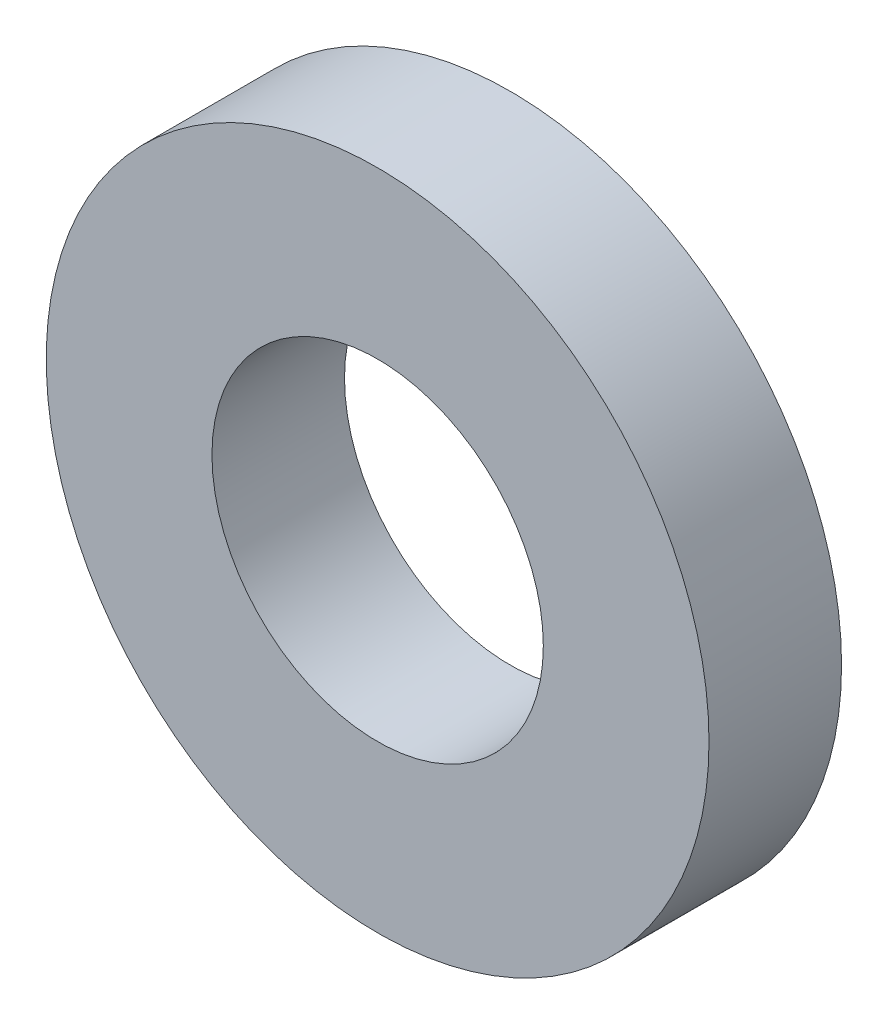
ISO-10303-21;
HEADER;
FILE_DESCRIPTION(('STEP AP214'),'2;1');
FILE_NAME('part.step','',(''),(''),'','','');
FILE_SCHEMA(('AUTOMOTIVE_DESIGN { 1 0 10303 214 1 1 1 1 }'));
ENDSEC;
DATA;
#1=APPLICATION_CONTEXT('core data for automotive mechanical design processes');
#2=APPLICATION_PROTOCOL_DEFINITION('international standard','automotive_design',2000,#1);
#3=PRODUCT_CONTEXT('',#1,'mechanical');
#4=PRODUCT('Part','Part','',(#3));
#5=PRODUCT_RELATED_PRODUCT_CATEGORY('part','',(#4));
#6=PRODUCT_DEFINITION_FORMATION('','',#4);
#7=PRODUCT_DEFINITION_CONTEXT('part definition',#1,'design');
#8=PRODUCT_DEFINITION('design','',#6,#7);
#9=PRODUCT_DEFINITION_SHAPE('','',#8);
#10=(LENGTH_UNIT() NAMED_UNIT(*) SI_UNIT(.MILLI.,.METRE.));
#11=(NAMED_UNIT(*) PLANE_ANGLE_UNIT() SI_UNIT($,.RADIAN.));
#12=(NAMED_UNIT(*) SI_UNIT($,.STERADIAN.) SOLID_ANGLE_UNIT());
#13=UNCERTAINTY_MEASURE_WITH_UNIT(LENGTH_MEASURE(1.E-05),#10,'distance_accuracy_value','');
#14=(GEOMETRIC_REPRESENTATION_CONTEXT(3) GLOBAL_UNCERTAINTY_ASSIGNED_CONTEXT((#13)) GLOBAL_UNIT_ASSIGNED_CONTEXT((#10,
#11,#12)) REPRESENTATION_CONTEXT('',''));
#15=CARTESIAN_POINT('',(0.,0.,0.));
#16=DIRECTION('',(0.,0.,1.));
#17=DIRECTION('',(1.,0.,0.));
#18=AXIS2_PLACEMENT_3D('',#15,#16,#17);
#19=CARTESIAN_POINT('',(0.,0.,4.));
#20=DIRECTION('',(0.,0.,1.));
#21=DIRECTION('',(1.,0.,0.));
#22=AXIS2_PLACEMENT_3D('',#19,#20,#21);
#23=PLANE('',#22);
#24=CARTESIAN_POINT('',(0.,0.,4.));
#25=DIRECTION('',(0.,0.,1.));
#26=DIRECTION('',(1.,0.,0.));
#27=AXIS2_PLACEMENT_3D('',#24,#25,#26);
#28=CIRCLE('',#27,10.);
#29=CARTESIAN_POINT('',(10.,0.,4.));
#30=VERTEX_POINT('',#29);
#31=EDGE_CURVE('E10',#30,#30,#28,.T.);
#32=ORIENTED_EDGE('',*,*,#31,.T.);
#33=EDGE_LOOP('',(#32));
#34=FACE_BOUND('',#33,.T.);
#35=CARTESIAN_POINT('',(0.,0.,4.));
#36=DIRECTION('',(0.,0.,1.));
#37=DIRECTION('',(1.,0.,0.));
#38=AXIS2_PLACEMENT_3D('',#35,#36,#37);
#39=CIRCLE('',#38,5.);
#40=CARTESIAN_POINT('',(5.,0.,4.));
#41=VERTEX_POINT('',#40);
#42=EDGE_CURVE('E50',#41,#41,#39,.T.);
#43=ORIENTED_EDGE('',*,*,#42,.F.);
#44=EDGE_LOOP('',(#43));
#45=FACE_BOUND('',#44,.T.);
#46=ADVANCED_FACE('F39',(#34,#45),#23,.T.);
#47=CARTESIAN_POINT('',(0.,0.,0.));
#48=DIRECTION('',(0.,0.,1.));
#49=DIRECTION('',(1.,0.,0.));
#50=AXIS2_PLACEMENT_3D('',#47,#48,#49);
#51=PLANE('',#50);
#52=CARTESIAN_POINT('',(0.,0.,0.));
#53=DIRECTION('',(0.,0.,1.));
#54=DIRECTION('',(1.,0.,0.));
#55=AXIS2_PLACEMENT_3D('',#52,#53,#54);
#56=CIRCLE('',#55,10.);
#57=CARTESIAN_POINT('',(10.,0.,0.));
#58=VERTEX_POINT('',#57);
#59=EDGE_CURVE('E43',#58,#58,#56,.T.);
#60=ORIENTED_EDGE('',*,*,#59,.F.);
#61=EDGE_LOOP('',(#60));
#62=FACE_BOUND('',#61,.T.);
#63=CARTESIAN_POINT('',(0.,0.,0.));
#64=DIRECTION('',(0.,0.,1.));
#65=DIRECTION('',(1.,0.,0.));
#66=AXIS2_PLACEMENT_3D('',#63,#64,#65);
#67=CIRCLE('',#66,5.);
#68=CARTESIAN_POINT('',(5.,0.,0.));
#69=VERTEX_POINT('',#68);
#70=EDGE_CURVE('E52',#69,#69,#67,.T.);
#71=ORIENTED_EDGE('',*,*,#70,.T.);
#72=EDGE_LOOP('',(#71));
#73=FACE_BOUND('',#72,.T.);
#74=ADVANCED_FACE('F62',(#62,#73),#51,.F.);
#75=CARTESIAN_POINT('',(0.,0.,4.));
#76=DIRECTION('',(0.,0.,-1.));
#77=DIRECTION('',(-1.,0.,0.));
#78=AXIS2_PLACEMENT_3D('',#75,#76,#77);
#79=CYLINDRICAL_SURFACE('',#78,10.);
#80=ORIENTED_EDGE('',*,*,#31,.F.);
#81=EDGE_LOOP('',(#80));
#82=FACE_BOUND('',#81,.T.);
#83=ORIENTED_EDGE('',*,*,#59,.T.);
#84=EDGE_LOOP('',(#83));
#85=FACE_BOUND('',#84,.T.);
#86=ADVANCED_FACE('F41',(#82,#85),#79,.T.);
#87=CARTESIAN_POINT('',(0.,0.,4.));
#88=DIRECTION('',(0.,0.,-1.));
#89=DIRECTION('',(-1.,0.,0.));
#90=AXIS2_PLACEMENT_3D('',#87,#88,#89);
#91=CYLINDRICAL_SURFACE('',#90,5.);
#92=ORIENTED_EDGE('',*,*,#42,.T.);
#93=EDGE_LOOP('',(#92));
#94=FACE_BOUND('',#93,.T.);
#95=ORIENTED_EDGE('',*,*,#70,.F.);
#96=EDGE_LOOP('',(#95));
#97=FACE_BOUND('',#96,.T.);
#98=ADVANCED_FACE('F58',(#94,#97),#91,.F.);
#99=CLOSED_SHELL('',(#46,#74,#86,#98));
#100=MANIFOLD_SOLID_BREP('B2',#99);
#101=ADVANCED_BREP_SHAPE_REPRESENTATION('',(#18,#100),#14);
#102=SHAPE_DEFINITION_REPRESENTATION(#9,#101);
ENDSEC;
END-ISO-10303-21;
